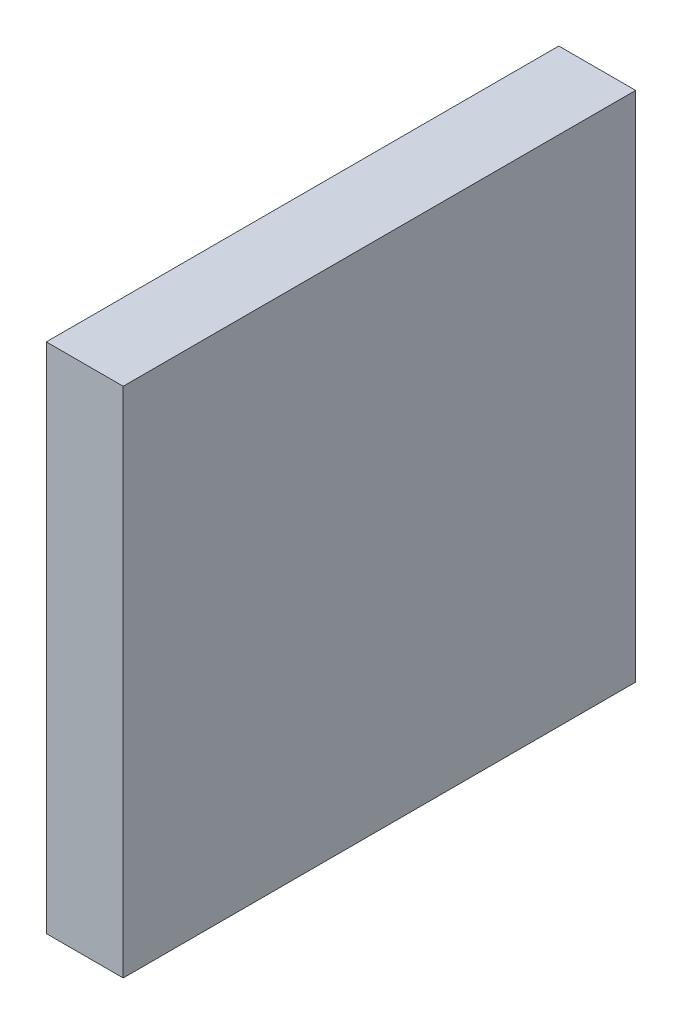
ISO-10303-21;
HEADER;
FILE_DESCRIPTION(('STEP AP214'),'2;1');
FILE_NAME('part.step','',(''),(''),'','','');
FILE_SCHEMA(('AUTOMOTIVE_DESIGN { 1 0 10303 214 1 1 1 1 }'));
ENDSEC;
DATA;
#1=APPLICATION_CONTEXT('core data for automotive mechanical design processes');
#2=APPLICATION_PROTOCOL_DEFINITION('international standard','automotive_design',2000,#1);
#3=PRODUCT_CONTEXT('',#1,'mechanical');
#4=PRODUCT('Part','Part','',(#3));
#5=PRODUCT_RELATED_PRODUCT_CATEGORY('part','',(#4));
#6=PRODUCT_DEFINITION_FORMATION('','',#4);
#7=PRODUCT_DEFINITION_CONTEXT('part definition',#1,'design');
#8=PRODUCT_DEFINITION('design','',#6,#7);
#9=PRODUCT_DEFINITION_SHAPE('','',#8);
#10=(LENGTH_UNIT() NAMED_UNIT(*) SI_UNIT(.MILLI.,.METRE.));
#11=(NAMED_UNIT(*) PLANE_ANGLE_UNIT() SI_UNIT($,.RADIAN.));
#12=(NAMED_UNIT(*) SI_UNIT($,.STERADIAN.) SOLID_ANGLE_UNIT());
#13=UNCERTAINTY_MEASURE_WITH_UNIT(LENGTH_MEASURE(1.E-05),#10,'distance_accuracy_value','');
#14=(GEOMETRIC_REPRESENTATION_CONTEXT(3) GLOBAL_UNCERTAINTY_ASSIGNED_CONTEXT((#13)) GLOBAL_UNIT_ASSIGNED_CONTEXT((#10,
#11,#12)) REPRESENTATION_CONTEXT('',''));
#15=CARTESIAN_POINT('',(0.,0.,0.));
#16=DIRECTION('',(0.,0.,1.));
#17=DIRECTION('',(1.,0.,0.));
#18=AXIS2_PLACEMENT_3D('',#15,#16,#17);
#19=CARTESIAN_POINT('',(15.,0.,0.));
#20=DIRECTION('',(0.,0.,-1.));
#21=DIRECTION('',(-1.,0.,0.));
#22=AXIS2_PLACEMENT_3D('',#19,#20,#21);
#23=PLANE('',#22);
#24=DIRECTION('',(0.,-1.,0.));
#25=VECTOR('',#24,1.);
#26=CARTESIAN_POINT('',(0.,0.,0.));
#27=LINE('',#26,#25);
#28=CARTESIAN_POINT('',(0.,100.,0.));
#29=VERTEX_POINT('',#28);
#30=CARTESIAN_POINT('',(0.,0.,0.));
#31=VERTEX_POINT('',#30);
#32=EDGE_CURVE('E96',#29,#31,#27,.T.);
#33=ORIENTED_EDGE('',*,*,#32,.T.);
#34=DIRECTION('',(-1.,0.,0.));
#35=VECTOR('',#34,1.);
#36=CARTESIAN_POINT('',(15.,0.,0.));
#37=LINE('',#36,#35);
#38=CARTESIAN_POINT('',(15.,0.,0.));
#39=VERTEX_POINT('',#38);
#40=EDGE_CURVE('E11',#39,#31,#37,.T.);
#41=ORIENTED_EDGE('',*,*,#40,.F.);
#42=DIRECTION('',(0.,-1.,0.));
#43=VECTOR('',#42,1.);
#44=CARTESIAN_POINT('',(15.,0.,0.));
#45=LINE('',#44,#43);
#46=CARTESIAN_POINT('',(15.,100.,0.));
#47=VERTEX_POINT('',#46);
#48=EDGE_CURVE('E84',#47,#39,#45,.T.);
#49=ORIENTED_EDGE('',*,*,#48,.F.);
#50=DIRECTION('',(-1.,0.,0.));
#51=VECTOR('',#50,1.);
#52=CARTESIAN_POINT('',(15.,100.,0.));
#53=LINE('',#52,#51);
#54=EDGE_CURVE('E92',#47,#29,#53,.T.);
#55=ORIENTED_EDGE('',*,*,#54,.T.);
#56=EDGE_LOOP('',(#33,#41,#49,#55));
#57=FACE_BOUND('',#56,.T.);
#58=ADVANCED_FACE('F33',(#57),#23,.F.);
#59=CARTESIAN_POINT('',(15.,0.,0.));
#60=DIRECTION('',(0.,1.,0.));
#61=DIRECTION('',(0.,0.,1.));
#62=AXIS2_PLACEMENT_3D('',#59,#60,#61);
#63=PLANE('',#62);
#64=DIRECTION('',(0.,0.,-1.));
#65=VECTOR('',#64,1.);
#66=CARTESIAN_POINT('',(0.,0.,0.));
#67=LINE('',#66,#65);
#68=CARTESIAN_POINT('',(0.,0.,-100.));
#69=VERTEX_POINT('',#68);
#70=EDGE_CURVE('E88',#31,#69,#67,.T.);
#71=ORIENTED_EDGE('',*,*,#70,.T.);
#72=DIRECTION('',(-1.,0.,0.));
#73=VECTOR('',#72,1.);
#74=CARTESIAN_POINT('',(15.,0.,-100.));
#75=LINE('',#74,#73);
#76=CARTESIAN_POINT('',(15.,0.,-100.));
#77=VERTEX_POINT('',#76);
#78=EDGE_CURVE('E41',#77,#69,#75,.T.);
#79=ORIENTED_EDGE('',*,*,#78,.F.);
#80=DIRECTION('',(0.,0.,-1.));
#81=VECTOR('',#80,1.);
#82=CARTESIAN_POINT('',(15.,0.,0.));
#83=LINE('',#82,#81);
#84=EDGE_CURVE('E79',#39,#77,#83,.T.);
#85=ORIENTED_EDGE('',*,*,#84,.F.);
#86=ORIENTED_EDGE('',*,*,#40,.T.);
#87=EDGE_LOOP('',(#71,#79,#85,#86));
#88=FACE_BOUND('',#87,.T.);
#89=ADVANCED_FACE('F87',(#88),#63,.F.);
#90=CARTESIAN_POINT('',(15.,0.,-100.));
#91=DIRECTION('',(0.,0.,1.));
#92=DIRECTION('',(1.,0.,0.));
#93=AXIS2_PLACEMENT_3D('',#90,#91,#92);
#94=PLANE('',#93);
#95=DIRECTION('',(0.,1.,0.));
#96=VECTOR('',#95,1.);
#97=CARTESIAN_POINT('',(0.,0.,-100.));
#98=LINE('',#97,#96);
#99=CARTESIAN_POINT('',(0.,100.,-100.));
#100=VERTEX_POINT('',#99);
#101=EDGE_CURVE('E66',#69,#100,#98,.T.);
#102=ORIENTED_EDGE('',*,*,#101,.T.);
#103=DIRECTION('',(-1.,0.,0.));
#104=VECTOR('',#103,1.);
#105=CARTESIAN_POINT('',(15.,100.,-100.));
#106=LINE('',#105,#104);
#107=CARTESIAN_POINT('',(15.,100.,-100.));
#108=VERTEX_POINT('',#107);
#109=EDGE_CURVE('E89',#108,#100,#106,.T.);
#110=ORIENTED_EDGE('',*,*,#109,.F.);
#111=DIRECTION('',(0.,1.,0.));
#112=VECTOR('',#111,1.);
#113=CARTESIAN_POINT('',(15.,0.,-100.));
#114=LINE('',#113,#112);
#115=EDGE_CURVE('E82',#77,#108,#114,.T.);
#116=ORIENTED_EDGE('',*,*,#115,.F.);
#117=ORIENTED_EDGE('',*,*,#78,.T.);
#118=EDGE_LOOP('',(#102,#110,#116,#117));
#119=FACE_BOUND('',#118,.T.);
#120=ADVANCED_FACE('F90',(#119),#94,.F.);
#121=CARTESIAN_POINT('',(15.,100.,0.));
#122=DIRECTION('',(0.,-1.,0.));
#123=DIRECTION('',(0.,0.,-1.));
#124=AXIS2_PLACEMENT_3D('',#121,#122,#123);
#125=PLANE('',#124);
#126=DIRECTION('',(0.,0.,1.));
#127=VECTOR('',#126,1.);
#128=CARTESIAN_POINT('',(0.,100.,0.));
#129=LINE('',#128,#127);
#130=EDGE_CURVE('E72',#100,#29,#129,.T.);
#131=ORIENTED_EDGE('',*,*,#130,.T.);
#132=ORIENTED_EDGE('',*,*,#54,.F.);
#133=DIRECTION('',(0.,0.,1.));
#134=VECTOR('',#133,1.);
#135=CARTESIAN_POINT('',(15.,100.,0.));
#136=LINE('',#135,#134);
#137=EDGE_CURVE('E49',#108,#47,#136,.T.);
#138=ORIENTED_EDGE('',*,*,#137,.F.);
#139=ORIENTED_EDGE('',*,*,#109,.T.);
#140=EDGE_LOOP('',(#131,#132,#138,#139));
#141=FACE_BOUND('',#140,.T.);
#142=ADVANCED_FACE('F103',(#141),#125,.F.);
#143=CARTESIAN_POINT('',(15.,0.,0.));
#144=DIRECTION('',(-1.,0.,0.));
#145=DIRECTION('',(0.,0.,1.));
#146=AXIS2_PLACEMENT_3D('',#143,#144,#145);
#147=PLANE('',#146);
#148=ORIENTED_EDGE('',*,*,#48,.T.);
#149=ORIENTED_EDGE('',*,*,#84,.T.);
#150=ORIENTED_EDGE('',*,*,#115,.T.);
#151=ORIENTED_EDGE('',*,*,#137,.T.);
#152=EDGE_LOOP('',(#148,#149,#150,#151));
#153=FACE_BOUND('',#152,.T.);
#154=ADVANCED_FACE('F80',(#153),#147,.F.);
#155=CARTESIAN_POINT('',(0.,0.,0.));
#156=DIRECTION('',(-1.,0.,0.));
#157=DIRECTION('',(0.,0.,1.));
#158=AXIS2_PLACEMENT_3D('',#155,#156,#157);
#159=PLANE('',#158);
#160=ORIENTED_EDGE('',*,*,#32,.F.);
#161=ORIENTED_EDGE('',*,*,#130,.F.);
#162=ORIENTED_EDGE('',*,*,#101,.F.);
#163=ORIENTED_EDGE('',*,*,#70,.F.);
#164=EDGE_LOOP('',(#160,#161,#162,#163));
#165=FACE_BOUND('',#164,.T.);
#166=ADVANCED_FACE('F106',(#165),#159,.T.);
#167=CLOSED_SHELL('',(#58,#89,#120,#142,#154,#166));
#168=MANIFOLD_SOLID_BREP('B2',#167);
#169=ADVANCED_BREP_SHAPE_REPRESENTATION('',(#18,#168),#14);
#170=SHAPE_DEFINITION_REPRESENTATION(#9,#169);
ENDSEC;
END-ISO-10303-21;
